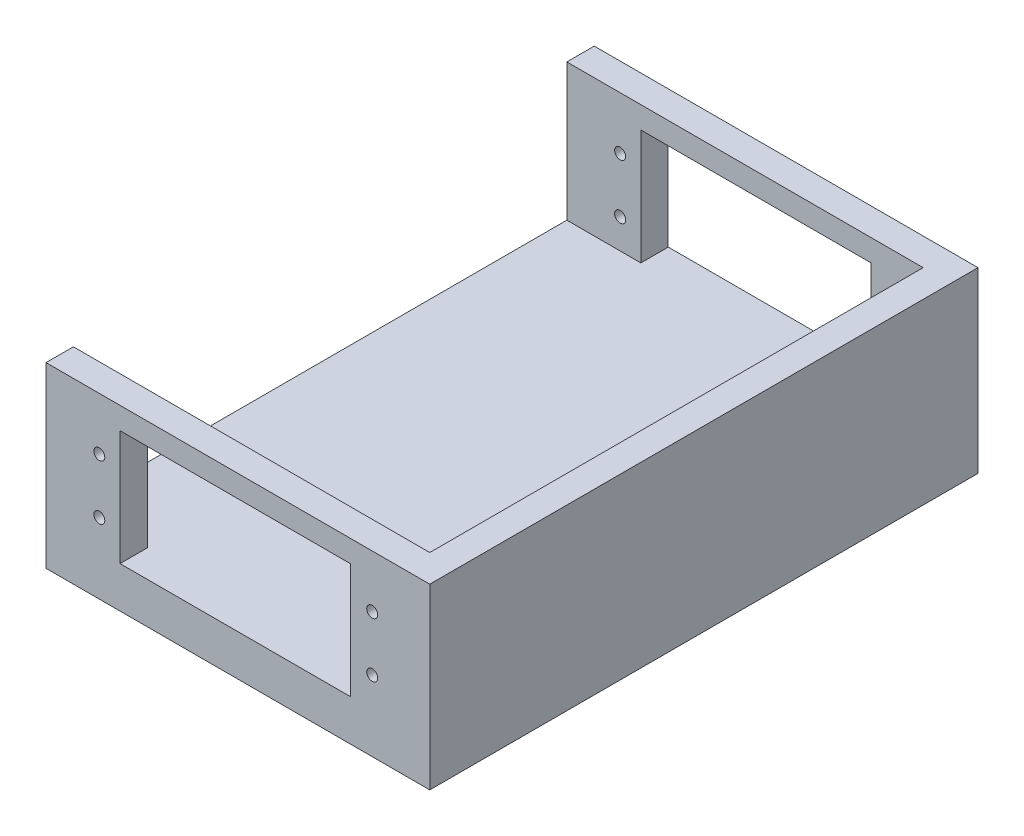
ISO-10303-21;
HEADER;
FILE_DESCRIPTION(('STEP AP214'),'2;1');
FILE_NAME('part.step','',(''),(''),'','','');
FILE_SCHEMA(('AUTOMOTIVE_DESIGN { 1 0 10303 214 1 1 1 1 }'));
ENDSEC;
DATA;
#1=APPLICATION_CONTEXT('core data for automotive mechanical design processes');
#2=APPLICATION_PROTOCOL_DEFINITION('international standard','automotive_design',2000,#1);
#3=PRODUCT_CONTEXT('',#1,'mechanical');
#4=PRODUCT('Part','Part','',(#3));
#5=PRODUCT_RELATED_PRODUCT_CATEGORY('part','',(#4));
#6=PRODUCT_DEFINITION_FORMATION('','',#4);
#7=PRODUCT_DEFINITION_CONTEXT('part definition',#1,'design');
#8=PRODUCT_DEFINITION('design','',#6,#7);
#9=PRODUCT_DEFINITION_SHAPE('','',#8);
#10=(LENGTH_UNIT() NAMED_UNIT(*) SI_UNIT(.MILLI.,.METRE.));
#11=(NAMED_UNIT(*) PLANE_ANGLE_UNIT() SI_UNIT($,.RADIAN.));
#12=(NAMED_UNIT(*) SI_UNIT($,.STERADIAN.) SOLID_ANGLE_UNIT());
#13=UNCERTAINTY_MEASURE_WITH_UNIT(LENGTH_MEASURE(1.E-05),#10,'distance_accuracy_value','');
#14=(GEOMETRIC_REPRESENTATION_CONTEXT(3) GLOBAL_UNCERTAINTY_ASSIGNED_CONTEXT((#13)) GLOBAL_UNIT_ASSIGNED_CONTEXT((#10,
#11,#12)) REPRESENTATION_CONTEXT('',''));
#15=CARTESIAN_POINT('',(0.,0.,0.));
#16=DIRECTION('',(0.,0.,1.));
#17=DIRECTION('',(1.,0.,0.));
#18=AXIS2_PLACEMENT_3D('',#15,#16,#17);
#19=CARTESIAN_POINT('',(0.,7.5,-100.));
#20=DIRECTION('',(0.,0.,-1.));
#21=DIRECTION('',(-1.,0.,0.));
#22=AXIS2_PLACEMENT_3D('',#19,#20,#21);
#23=PLANE('',#22);
#24=CARTESIAN_POINT('',(59.5,12.9,-100.));
#25=DIRECTION('',(0.,0.,1.));
#26=DIRECTION('',(1.,0.,0.));
#27=AXIS2_PLACEMENT_3D('',#24,#25,#26);
#28=CIRCLE('',#27,1.00000000000001);
#29=CARTESIAN_POINT('',(60.5,12.9,-100.));
#30=VERTEX_POINT('',#29);
#31=EDGE_CURVE('E180',#30,#30,#28,.T.);
#32=ORIENTED_EDGE('',*,*,#31,.T.);
#33=EDGE_LOOP('',(#32));
#34=FACE_BOUND('',#33,.T.);
#35=CARTESIAN_POINT('',(9.72077339804633,22.8999999999995,-100.));
#36=DIRECTION('',(0.,0.,1.));
#37=DIRECTION('',(1.,0.,0.));
#38=AXIS2_PLACEMENT_3D('',#35,#36,#37);
#39=CIRCLE('',#38,0.999999999999998);
#40=CARTESIAN_POINT('',(10.7207733980463,22.8999999999995,-100.));
#41=VERTEX_POINT('',#40);
#42=EDGE_CURVE('E183',#41,#41,#39,.T.);
#43=ORIENTED_EDGE('',*,*,#42,.T.);
#44=EDGE_LOOP('',(#43));
#45=FACE_BOUND('',#44,.T.);
#46=DIRECTION('',(1.,0.,0.));
#47=VECTOR('',#46,1.);
#48=CARTESIAN_POINT('',(0.,0.,-100.));
#49=LINE('',#48,#47);
#50=CARTESIAN_POINT('',(0.,0.,-100.));
#51=VERTEX_POINT('',#50);
#52=CARTESIAN_POINT('',(70.,0.,-100.));
#53=VERTEX_POINT('',#52);
#54=EDGE_CURVE('E217',#51,#53,#49,.T.);
#55=ORIENTED_EDGE('',*,*,#54,.F.);
#56=DIRECTION('',(0.,-1.,0.));
#57=VECTOR('',#56,1.);
#58=CARTESIAN_POINT('',(0.,7.5,-100.));
#59=LINE('',#58,#57);
#60=CARTESIAN_POINT('',(0.,32.5,-100.));
#61=VERTEX_POINT('',#60);
#62=EDGE_CURVE('E220',#61,#51,#59,.T.);
#63=ORIENTED_EDGE('',*,*,#62,.F.);
#64=DIRECTION('',(1.,0.,0.));
#65=VECTOR('',#64,1.);
#66=CARTESIAN_POINT('',(0.,32.5,-100.));
#67=LINE('',#66,#65);
#68=CARTESIAN_POINT('',(70.,32.5,-100.));
#69=VERTEX_POINT('',#68);
#70=EDGE_CURVE('E171',#61,#69,#67,.T.);
#71=ORIENTED_EDGE('',*,*,#70,.T.);
#72=DIRECTION('',(0.,-1.,0.));
#73=VECTOR('',#72,1.);
#74=CARTESIAN_POINT('',(70.,7.5,-100.));
#75=LINE('',#74,#73);
#76=EDGE_CURVE('E223',#69,#53,#75,.T.);
#77=ORIENTED_EDGE('',*,*,#76,.T.);
#78=EDGE_LOOP('',(#55,#63,#71,#77));
#79=FACE_BOUND('',#78,.T.);
#80=DIRECTION('',(-1.,0.,0.));
#81=VECTOR('',#80,1.);
#82=CARTESIAN_POINT('',(13.5,28.5,-100.));
#83=LINE('',#82,#81);
#84=CARTESIAN_POINT('',(55.5,28.5,-100.));
#85=VERTEX_POINT('',#84);
#86=CARTESIAN_POINT('',(13.5,28.5,-100.));
#87=VERTEX_POINT('',#86);
#88=EDGE_CURVE('E192',#85,#87,#83,.T.);
#89=ORIENTED_EDGE('',*,*,#88,.T.);
#90=DIRECTION('',(0.,-1.,0.));
#91=VECTOR('',#90,1.);
#92=CARTESIAN_POINT('',(13.5,28.5,-100.));
#93=LINE('',#92,#91);
#94=CARTESIAN_POINT('',(13.5,7.5,-100.));
#95=VERTEX_POINT('',#94);
#96=EDGE_CURVE('E60',#87,#95,#93,.T.);
#97=ORIENTED_EDGE('',*,*,#96,.T.);
#98=DIRECTION('',(1.,0.,0.));
#99=VECTOR('',#98,1.);
#100=CARTESIAN_POINT('',(13.5,7.5,-100.));
#101=LINE('',#100,#99);
#102=CARTESIAN_POINT('',(55.5,7.5,-100.));
#103=VERTEX_POINT('',#102);
#104=EDGE_CURVE('E198',#95,#103,#101,.T.);
#105=ORIENTED_EDGE('',*,*,#104,.T.);
#106=DIRECTION('',(0.,1.,0.));
#107=VECTOR('',#106,1.);
#108=CARTESIAN_POINT('',(55.5,28.5,-100.));
#109=LINE('',#108,#107);
#110=EDGE_CURVE('E195',#103,#85,#109,.T.);
#111=ORIENTED_EDGE('',*,*,#110,.T.);
#112=EDGE_LOOP('',(#89,#97,#105,#111));
#113=FACE_BOUND('',#112,.T.);
#114=CARTESIAN_POINT('',(9.72077339804633,12.8999999999995,-100.));
#115=DIRECTION('',(0.,0.,1.));
#116=DIRECTION('',(1.,0.,0.));
#117=AXIS2_PLACEMENT_3D('',#114,#115,#116);
#118=CIRCLE('',#117,0.999999999999998);
#119=CARTESIAN_POINT('',(10.7207733980463,12.8999999999995,-100.));
#120=VERTEX_POINT('',#119);
#121=EDGE_CURVE('E186',#120,#120,#118,.T.);
#122=ORIENTED_EDGE('',*,*,#121,.T.);
#123=EDGE_LOOP('',(#122));
#124=FACE_BOUND('',#123,.T.);
#125=CARTESIAN_POINT('',(59.5,22.9,-100.));
#126=DIRECTION('',(0.,0.,1.));
#127=DIRECTION('',(1.,0.,0.));
#128=AXIS2_PLACEMENT_3D('',#125,#126,#127);
#129=CIRCLE('',#128,0.999999999999998);
#130=CARTESIAN_POINT('',(60.5,22.9,-100.));
#131=VERTEX_POINT('',#130);
#132=EDGE_CURVE('E177',#131,#131,#129,.T.);
#133=ORIENTED_EDGE('',*,*,#132,.T.);
#134=EDGE_LOOP('',(#133));
#135=FACE_BOUND('',#134,.T.);
#136=ADVANCED_FACE('F35',(#34,#45,#79,#113,#124,#135),#23,.T.);
#137=CARTESIAN_POINT('',(0.,32.5,-95.));
#138=DIRECTION('',(0.,0.,1.));
#139=DIRECTION('',(1.,0.,0.));
#140=AXIS2_PLACEMENT_3D('',#137,#138,#139);
#141=PLANE('',#140);
#142=DIRECTION('',(0.,1.,0.));
#143=VECTOR('',#142,1.);
#144=CARTESIAN_POINT('',(65.,7.5,-95.));
#145=LINE('',#144,#143);
#146=CARTESIAN_POINT('',(65.,7.5,-95.));
#147=VERTEX_POINT('',#146);
#148=CARTESIAN_POINT('',(65.,32.5,-95.));
#149=VERTEX_POINT('',#148);
#150=EDGE_CURVE('E155',#147,#149,#145,.T.);
#151=ORIENTED_EDGE('',*,*,#150,.T.);
#152=DIRECTION('',(-1.,0.,0.));
#153=VECTOR('',#152,1.);
#154=CARTESIAN_POINT('',(0.,32.5,-95.));
#155=LINE('',#154,#153);
#156=CARTESIAN_POINT('',(0.,32.5,-95.));
#157=VERTEX_POINT('',#156);
#158=EDGE_CURVE('E162',#149,#157,#155,.T.);
#159=ORIENTED_EDGE('',*,*,#158,.T.);
#160=DIRECTION('',(0.,-1.,0.));
#161=VECTOR('',#160,1.);
#162=CARTESIAN_POINT('',(0.,32.5,-95.));
#163=LINE('',#162,#161);
#164=CARTESIAN_POINT('',(0.,7.5,-95.));
#165=VERTEX_POINT('',#164);
#166=EDGE_CURVE('E213',#157,#165,#163,.T.);
#167=ORIENTED_EDGE('',*,*,#166,.T.);
#168=DIRECTION('',(-1.,0.,0.));
#169=VECTOR('',#168,1.);
#170=CARTESIAN_POINT('',(0.,7.5,-95.));
#171=LINE('',#170,#169);
#172=CARTESIAN_POINT('',(13.5,7.5,-95.));
#173=VERTEX_POINT('',#172);
#174=EDGE_CURVE('E215',#173,#165,#171,.T.);
#175=ORIENTED_EDGE('',*,*,#174,.F.);
#176=DIRECTION('',(0.,1.,0.));
#177=VECTOR('',#176,1.);
#178=CARTESIAN_POINT('',(13.5,32.5,-95.));
#179=LINE('',#178,#177);
#180=CARTESIAN_POINT('',(13.5,28.5,-95.));
#181=VERTEX_POINT('',#180);
#182=EDGE_CURVE('E11',#173,#181,#179,.T.);
#183=ORIENTED_EDGE('',*,*,#182,.T.);
#184=DIRECTION('',(1.,0.,0.));
#185=VECTOR('',#184,1.);
#186=CARTESIAN_POINT('',(0.,28.5,-95.));
#187=LINE('',#186,#185);
#188=CARTESIAN_POINT('',(55.5,28.5,-95.));
#189=VERTEX_POINT('',#188);
#190=EDGE_CURVE('E300',#181,#189,#187,.T.);
#191=ORIENTED_EDGE('',*,*,#190,.T.);
#192=DIRECTION('',(0.,-1.,0.));
#193=VECTOR('',#192,1.);
#194=CARTESIAN_POINT('',(55.5,32.5,-95.));
#195=LINE('',#194,#193);
#196=CARTESIAN_POINT('',(55.5,7.5,-95.));
#197=VERTEX_POINT('',#196);
#198=EDGE_CURVE('E44',#189,#197,#195,.T.);
#199=ORIENTED_EDGE('',*,*,#198,.T.);
#200=EDGE_CURVE('E176',#147,#197,#171,.T.);
#201=ORIENTED_EDGE('',*,*,#200,.F.);
#202=EDGE_LOOP('',(#151,#159,#167,#175,#183,#191,#199,#201));
#203=FACE_BOUND('',#202,.T.);
#204=CARTESIAN_POINT('',(59.5,12.9,-95.));
#205=DIRECTION('',(0.,0.,1.));
#206=DIRECTION('',(1.,0.,0.));
#207=AXIS2_PLACEMENT_3D('',#204,#205,#206);
#208=CIRCLE('',#207,1.00000000000001);
#209=CARTESIAN_POINT('',(60.5,12.9,-95.));
#210=VERTEX_POINT('',#209);
#211=EDGE_CURVE('E319',#210,#210,#208,.F.);
#212=ORIENTED_EDGE('',*,*,#211,.T.);
#213=EDGE_LOOP('',(#212));
#214=FACE_BOUND('',#213,.T.);
#215=CARTESIAN_POINT('',(9.72077339804633,22.8999999999995,-95.));
#216=DIRECTION('',(0.,0.,1.));
#217=DIRECTION('',(1.,0.,0.));
#218=AXIS2_PLACEMENT_3D('',#215,#216,#217);
#219=CIRCLE('',#218,0.999999999999998);
#220=CARTESIAN_POINT('',(10.7207733980463,22.8999999999995,-95.));
#221=VERTEX_POINT('',#220);
#222=EDGE_CURVE('E204',#221,#221,#219,.F.);
#223=ORIENTED_EDGE('',*,*,#222,.T.);
#224=EDGE_LOOP('',(#223));
#225=FACE_BOUND('',#224,.T.);
#226=CARTESIAN_POINT('',(9.72077339804633,12.8999999999995,-95.));
#227=DIRECTION('',(0.,0.,1.));
#228=DIRECTION('',(1.,0.,0.));
#229=AXIS2_PLACEMENT_3D('',#226,#227,#228);
#230=CIRCLE('',#229,0.999999999999998);
#231=CARTESIAN_POINT('',(10.7207733980463,12.8999999999995,-95.));
#232=VERTEX_POINT('',#231);
#233=EDGE_CURVE('E317',#232,#232,#230,.F.);
#234=ORIENTED_EDGE('',*,*,#233,.T.);
#235=EDGE_LOOP('',(#234));
#236=FACE_BOUND('',#235,.T.);
#237=CARTESIAN_POINT('',(59.5,22.9,-95.));
#238=DIRECTION('',(0.,0.,1.));
#239=DIRECTION('',(1.,0.,0.));
#240=AXIS2_PLACEMENT_3D('',#237,#238,#239);
#241=CIRCLE('',#240,0.999999999999998);
#242=CARTESIAN_POINT('',(60.5,22.9,-95.));
#243=VERTEX_POINT('',#242);
#244=EDGE_CURVE('E39',#243,#243,#241,.F.);
#245=ORIENTED_EDGE('',*,*,#244,.T.);
#246=EDGE_LOOP('',(#245));
#247=FACE_BOUND('',#246,.T.);
#248=ADVANCED_FACE('F173',(#203,#214,#225,#236,#247),#141,.T.);
#249=CARTESIAN_POINT('',(0.,7.5,0.));
#250=DIRECTION('',(0.,-1.,0.));
#251=DIRECTION('',(0.,0.,-1.));
#252=AXIS2_PLACEMENT_3D('',#249,#250,#251);
#253=PLANE('',#252);
#254=DIRECTION('',(0.,0.,1.));
#255=VECTOR('',#254,1.);
#256=CARTESIAN_POINT('',(65.,7.5,-75.4950975679639));
#257=LINE('',#256,#255);
#258=CARTESIAN_POINT('',(65.,7.5,-5.));
#259=VERTEX_POINT('',#258);
#260=EDGE_CURVE('E52',#147,#259,#257,.T.);
#261=ORIENTED_EDGE('',*,*,#260,.F.);
#262=ORIENTED_EDGE('',*,*,#200,.T.);
#263=DIRECTION('',(0.,0.,-1.));
#264=VECTOR('',#263,1.);
#265=CARTESIAN_POINT('',(55.5,7.5,-70.));
#266=LINE('',#265,#264);
#267=EDGE_CURVE('E205',#197,#103,#266,.T.);
#268=ORIENTED_EDGE('',*,*,#267,.T.);
#269=ORIENTED_EDGE('',*,*,#104,.F.);
#270=DIRECTION('',(0.,0.,-1.));
#271=VECTOR('',#270,1.);
#272=CARTESIAN_POINT('',(13.5,7.5,-70.));
#273=LINE('',#272,#271);
#274=EDGE_CURVE('E202',#173,#95,#273,.T.);
#275=ORIENTED_EDGE('',*,*,#274,.F.);
#276=ORIENTED_EDGE('',*,*,#174,.T.);
#277=DIRECTION('',(0.,0.,1.));
#278=VECTOR('',#277,1.);
#279=CARTESIAN_POINT('',(0.,7.5,0.));
#280=LINE('',#279,#278);
#281=CARTESIAN_POINT('',(0.,7.5,-5.));
#282=VERTEX_POINT('',#281);
#283=EDGE_CURVE('E277',#165,#282,#280,.T.);
#284=ORIENTED_EDGE('',*,*,#283,.T.);
#285=DIRECTION('',(-1.,0.,0.));
#286=VECTOR('',#285,1.);
#287=CARTESIAN_POINT('',(0.,7.5,-5.));
#288=LINE('',#287,#286);
#289=CARTESIAN_POINT('',(13.5,7.5,-5.));
#290=VERTEX_POINT('',#289);
#291=EDGE_CURVE('E273',#290,#282,#288,.T.);
#292=ORIENTED_EDGE('',*,*,#291,.F.);
#293=DIRECTION('',(0.,0.,1.));
#294=VECTOR('',#293,1.);
#295=CARTESIAN_POINT('',(13.5,7.5,-30.));
#296=LINE('',#295,#294);
#297=CARTESIAN_POINT('',(13.5,7.5,0.));
#298=VERTEX_POINT('',#297);
#299=EDGE_CURVE('E251',#290,#298,#296,.T.);
#300=ORIENTED_EDGE('',*,*,#299,.T.);
#301=DIRECTION('',(1.,0.,0.));
#302=VECTOR('',#301,1.);
#303=CARTESIAN_POINT('',(13.5,7.5,0.));
#304=LINE('',#303,#302);
#305=CARTESIAN_POINT('',(55.5,7.5,0.));
#306=VERTEX_POINT('',#305);
#307=EDGE_CURVE('E242',#298,#306,#304,.T.);
#308=ORIENTED_EDGE('',*,*,#307,.T.);
#309=DIRECTION('',(0.,0.,1.));
#310=VECTOR('',#309,1.);
#311=CARTESIAN_POINT('',(55.5,7.5,-30.));
#312=LINE('',#311,#310);
#313=CARTESIAN_POINT('',(55.5,7.5,-5.));
#314=VERTEX_POINT('',#313);
#315=EDGE_CURVE('E257',#314,#306,#312,.T.);
#316=ORIENTED_EDGE('',*,*,#315,.F.);
#317=EDGE_CURVE('E264',#259,#314,#288,.T.);
#318=ORIENTED_EDGE('',*,*,#317,.F.);
#319=EDGE_LOOP('',(#261,#262,#268,#269,#275,#276,#284,#292,#300,#308,#316,#318));
#320=FACE_BOUND('',#319,.T.);
#321=ADVANCED_FACE('F327',(#320),#253,.F.);
#322=CARTESIAN_POINT('',(0.,32.5,-5.));
#323=DIRECTION('',(0.,0.,1.));
#324=DIRECTION('',(1.,0.,0.));
#325=AXIS2_PLACEMENT_3D('',#322,#323,#324);
#326=PLANE('',#325);
#327=CARTESIAN_POINT('',(9.72077339804633,22.8999999999995,-5.));
#328=DIRECTION('',(0.,0.,1.));
#329=DIRECTION('',(1.,0.,0.));
#330=AXIS2_PLACEMENT_3D('',#327,#328,#329);
#331=CIRCLE('',#330,0.999999999999998);
#332=CARTESIAN_POINT('',(10.7207733980463,22.8999999999995,-5.));
#333=VERTEX_POINT('',#332);
#334=EDGE_CURVE('E254',#333,#333,#331,.T.);
#335=ORIENTED_EDGE('',*,*,#334,.T.);
#336=EDGE_LOOP('',(#335));
#337=FACE_BOUND('',#336,.T.);
#338=CARTESIAN_POINT('',(9.72077339804633,12.8999999999995,-5.));
#339=DIRECTION('',(0.,0.,1.));
#340=DIRECTION('',(1.,0.,0.));
#341=AXIS2_PLACEMENT_3D('',#338,#339,#340);
#342=CIRCLE('',#341,0.999999999999998);
#343=CARTESIAN_POINT('',(10.7207733980463,12.8999999999995,-5.));
#344=VERTEX_POINT('',#343);
#345=EDGE_CURVE('E303',#344,#344,#342,.T.);
#346=ORIENTED_EDGE('',*,*,#345,.T.);
#347=EDGE_LOOP('',(#346));
#348=FACE_BOUND('',#347,.T.);
#349=CARTESIAN_POINT('',(59.5,12.9,-5.));
#350=DIRECTION('',(0.,0.,1.));
#351=DIRECTION('',(1.,0.,0.));
#352=AXIS2_PLACEMENT_3D('',#349,#350,#351);
#353=CIRCLE('',#352,1.00000000000001);
#354=CARTESIAN_POINT('',(60.5,12.9,-5.));
#355=VERTEX_POINT('',#354);
#356=EDGE_CURVE('E306',#355,#355,#353,.T.);
#357=ORIENTED_EDGE('',*,*,#356,.T.);
#358=EDGE_LOOP('',(#357));
#359=FACE_BOUND('',#358,.T.);
#360=CARTESIAN_POINT('',(59.5,22.9,-5.));
#361=DIRECTION('',(0.,0.,1.));
#362=DIRECTION('',(1.,0.,0.));
#363=AXIS2_PLACEMENT_3D('',#360,#361,#362);
#364=CIRCLE('',#363,0.999999999999998);
#365=CARTESIAN_POINT('',(60.5,22.9,-5.));
#366=VERTEX_POINT('',#365);
#367=EDGE_CURVE('E309',#366,#366,#364,.T.);
#368=ORIENTED_EDGE('',*,*,#367,.T.);
#369=EDGE_LOOP('',(#368));
#370=FACE_BOUND('',#369,.T.);
#371=DIRECTION('',(0.,1.,0.));
#372=VECTOR('',#371,1.);
#373=CARTESIAN_POINT('',(65.,7.5,-5.));
#374=LINE('',#373,#372);
#375=CARTESIAN_POINT('',(65.,32.5,-5.));
#376=VERTEX_POINT('',#375);
#377=EDGE_CURVE('E157',#259,#376,#374,.T.);
#378=ORIENTED_EDGE('',*,*,#377,.F.);
#379=ORIENTED_EDGE('',*,*,#317,.T.);
#380=DIRECTION('',(0.,1.,0.));
#381=VECTOR('',#380,1.);
#382=CARTESIAN_POINT('',(55.5,32.5,-5.));
#383=LINE('',#382,#381);
#384=CARTESIAN_POINT('',(55.5,28.5,-5.));
#385=VERTEX_POINT('',#384);
#386=EDGE_CURVE('E291',#314,#385,#383,.T.);
#387=ORIENTED_EDGE('',*,*,#386,.T.);
#388=DIRECTION('',(-1.,0.,0.));
#389=VECTOR('',#388,1.);
#390=CARTESIAN_POINT('',(0.,28.5,-5.));
#391=LINE('',#390,#389);
#392=CARTESIAN_POINT('',(13.5,28.5,-5.));
#393=VERTEX_POINT('',#392);
#394=EDGE_CURVE('E294',#385,#393,#391,.T.);
#395=ORIENTED_EDGE('',*,*,#394,.T.);
#396=DIRECTION('',(0.,-1.,0.));
#397=VECTOR('',#396,1.);
#398=CARTESIAN_POINT('',(13.5,32.5,-5.));
#399=LINE('',#398,#397);
#400=EDGE_CURVE('E297',#393,#290,#399,.T.);
#401=ORIENTED_EDGE('',*,*,#400,.T.);
#402=ORIENTED_EDGE('',*,*,#291,.T.);
#403=DIRECTION('',(0.,-1.,0.));
#404=VECTOR('',#403,1.);
#405=CARTESIAN_POINT('',(0.,32.5,-5.));
#406=LINE('',#405,#404);
#407=CARTESIAN_POINT('',(0.,32.5,-5.));
#408=VERTEX_POINT('',#407);
#409=EDGE_CURVE('E271',#408,#282,#406,.T.);
#410=ORIENTED_EDGE('',*,*,#409,.F.);
#411=DIRECTION('',(-1.,0.,0.));
#412=VECTOR('',#411,1.);
#413=CARTESIAN_POINT('',(0.,32.5,-5.));
#414=LINE('',#413,#412);
#415=EDGE_CURVE('E269',#376,#408,#414,.T.);
#416=ORIENTED_EDGE('',*,*,#415,.F.);
#417=EDGE_LOOP('',(#378,#379,#387,#395,#401,#402,#410,#416));
#418=FACE_BOUND('',#417,.T.);
#419=ADVANCED_FACE('F336',(#337,#348,#359,#370,#418),#326,.F.);
#420=CARTESIAN_POINT('',(0.,7.5,0.));
#421=DIRECTION('',(1.,0.,0.));
#422=DIRECTION('',(0.,0.,-1.));
#423=AXIS2_PLACEMENT_3D('',#420,#421,#422);
#424=PLANE('',#423);
#425=DIRECTION('',(0.,0.,1.));
#426=VECTOR('',#425,1.);
#427=CARTESIAN_POINT('',(0.,0.,0.));
#428=LINE('',#427,#426);
#429=CARTESIAN_POINT('',(0.,0.,0.));
#430=VERTEX_POINT('',#429);
#431=EDGE_CURVE('E276',#51,#430,#428,.T.);
#432=ORIENTED_EDGE('',*,*,#431,.T.);
#433=DIRECTION('',(0.,-1.,0.));
#434=VECTOR('',#433,1.);
#435=CARTESIAN_POINT('',(0.,7.5,0.));
#436=LINE('',#435,#434);
#437=CARTESIAN_POINT('',(0.,32.5,0.));
#438=VERTEX_POINT('',#437);
#439=EDGE_CURVE('E288',#438,#430,#436,.T.);
#440=ORIENTED_EDGE('',*,*,#439,.F.);
#441=DIRECTION('',(0.,0.,1.));
#442=VECTOR('',#441,1.);
#443=CARTESIAN_POINT('',(0.,32.5,0.));
#444=LINE('',#443,#442);
#445=EDGE_CURVE('E261',#408,#438,#444,.T.);
#446=ORIENTED_EDGE('',*,*,#445,.F.);
#447=ORIENTED_EDGE('',*,*,#409,.T.);
#448=ORIENTED_EDGE('',*,*,#283,.F.);
#449=ORIENTED_EDGE('',*,*,#166,.F.);
#450=DIRECTION('',(0.,0.,-1.));
#451=VECTOR('',#450,1.);
#452=CARTESIAN_POINT('',(0.,32.5,-100.));
#453=LINE('',#452,#451);
#454=EDGE_CURVE('E167',#157,#61,#453,.T.);
#455=ORIENTED_EDGE('',*,*,#454,.T.);
#456=ORIENTED_EDGE('',*,*,#62,.T.);
#457=EDGE_LOOP('',(#432,#440,#446,#447,#448,#449,#455,#456));
#458=FACE_BOUND('',#457,.T.);
#459=ADVANCED_FACE('F37',(#458),#424,.F.);
#460=CARTESIAN_POINT('',(0.,7.5,0.));
#461=DIRECTION('',(0.,0.,-1.));
#462=DIRECTION('',(-1.,0.,0.));
#463=AXIS2_PLACEMENT_3D('',#460,#461,#462);
#464=PLANE('',#463);
#465=CARTESIAN_POINT('',(59.5,22.9,0.));
#466=DIRECTION('',(0.,0.,1.));
#467=DIRECTION('',(1.,0.,0.));
#468=AXIS2_PLACEMENT_3D('',#465,#466,#467);
#469=CIRCLE('',#468,0.999999999999998);
#470=CARTESIAN_POINT('',(60.5,22.9,0.));
#471=VERTEX_POINT('',#470);
#472=EDGE_CURVE('E228',#471,#471,#469,.T.);
#473=ORIENTED_EDGE('',*,*,#472,.F.);
#474=EDGE_LOOP('',(#473));
#475=FACE_BOUND('',#474,.T.);
#476=CARTESIAN_POINT('',(59.5,12.9,0.));
#477=DIRECTION('',(0.,0.,1.));
#478=DIRECTION('',(1.,0.,0.));
#479=AXIS2_PLACEMENT_3D('',#476,#477,#478);
#480=CIRCLE('',#479,1.00000000000001);
#481=CARTESIAN_POINT('',(60.5,12.9,0.));
#482=VERTEX_POINT('',#481);
#483=EDGE_CURVE('E236',#482,#482,#480,.T.);
#484=ORIENTED_EDGE('',*,*,#483,.F.);
#485=EDGE_LOOP('',(#484));
#486=FACE_BOUND('',#485,.T.);
#487=CARTESIAN_POINT('',(9.72077339804633,12.8999999999995,0.));
#488=DIRECTION('',(0.,0.,1.));
#489=DIRECTION('',(1.,0.,0.));
#490=AXIS2_PLACEMENT_3D('',#487,#488,#489);
#491=CIRCLE('',#490,0.999999999999998);
#492=CARTESIAN_POINT('',(10.7207733980463,12.8999999999995,0.));
#493=VERTEX_POINT('',#492);
#494=EDGE_CURVE('E233',#493,#493,#491,.T.);
#495=ORIENTED_EDGE('',*,*,#494,.F.);
#496=EDGE_LOOP('',(#495));
#497=FACE_BOUND('',#496,.T.);
#498=CARTESIAN_POINT('',(9.72077339804633,22.8999999999995,0.));
#499=DIRECTION('',(0.,0.,1.));
#500=DIRECTION('',(1.,0.,0.));
#501=AXIS2_PLACEMENT_3D('',#498,#499,#500);
#502=CIRCLE('',#501,0.999999999999998);
#503=CARTESIAN_POINT('',(10.7207733980463,22.8999999999995,0.));
#504=VERTEX_POINT('',#503);
#505=EDGE_CURVE('E229',#504,#504,#502,.T.);
#506=ORIENTED_EDGE('',*,*,#505,.F.);
#507=EDGE_LOOP('',(#506));
#508=FACE_BOUND('',#507,.T.);
#509=ORIENTED_EDGE('',*,*,#307,.F.);
#510=DIRECTION('',(0.,-1.,0.));
#511=VECTOR('',#510,1.);
#512=CARTESIAN_POINT('',(13.5,28.5,0.));
#513=LINE('',#512,#511);
#514=CARTESIAN_POINT('',(13.5,28.5,0.));
#515=VERTEX_POINT('',#514);
#516=EDGE_CURVE('E232',#515,#298,#513,.T.);
#517=ORIENTED_EDGE('',*,*,#516,.F.);
#518=DIRECTION('',(-1.,0.,0.));
#519=VECTOR('',#518,1.);
#520=CARTESIAN_POINT('',(13.5,28.5,0.));
#521=LINE('',#520,#519);
#522=CARTESIAN_POINT('',(55.5,28.5,0.));
#523=VERTEX_POINT('',#522);
#524=EDGE_CURVE('E248',#523,#515,#521,.T.);
#525=ORIENTED_EDGE('',*,*,#524,.F.);
#526=DIRECTION('',(0.,1.,0.));
#527=VECTOR('',#526,1.);
#528=CARTESIAN_POINT('',(55.5,28.5,0.));
#529=LINE('',#528,#527);
#530=EDGE_CURVE('E245',#306,#523,#529,.T.);
#531=ORIENTED_EDGE('',*,*,#530,.F.);
#532=EDGE_LOOP('',(#509,#517,#525,#531));
#533=FACE_BOUND('',#532,.T.);
#534=DIRECTION('',(1.,0.,0.));
#535=VECTOR('',#534,1.);
#536=CARTESIAN_POINT('',(0.,0.,0.));
#537=LINE('',#536,#535);
#538=CARTESIAN_POINT('',(70.,0.,0.));
#539=VERTEX_POINT('',#538);
#540=EDGE_CURVE('E283',#430,#539,#537,.T.);
#541=ORIENTED_EDGE('',*,*,#540,.T.);
#542=DIRECTION('',(0.,-1.,0.));
#543=VECTOR('',#542,1.);
#544=CARTESIAN_POINT('',(70.,7.5,0.));
#545=LINE('',#544,#543);
#546=CARTESIAN_POINT('',(70.,32.5,0.));
#547=VERTEX_POINT('',#546);
#548=EDGE_CURVE('E279',#547,#539,#545,.T.);
#549=ORIENTED_EDGE('',*,*,#548,.F.);
#550=DIRECTION('',(1.,0.,0.));
#551=VECTOR('',#550,1.);
#552=CARTESIAN_POINT('',(0.,32.5,0.));
#553=LINE('',#552,#551);
#554=EDGE_CURVE('E263',#438,#547,#553,.T.);
#555=ORIENTED_EDGE('',*,*,#554,.F.);
#556=ORIENTED_EDGE('',*,*,#439,.T.);
#557=EDGE_LOOP('',(#541,#549,#555,#556));
#558=FACE_BOUND('',#557,.T.);
#559=ADVANCED_FACE('F343',(#475,#486,#497,#508,#533,#558),#464,.F.);
#560=CARTESIAN_POINT('',(70.,7.5,0.));
#561=DIRECTION('',(-1.,0.,0.));
#562=DIRECTION('',(0.,0.,1.));
#563=AXIS2_PLACEMENT_3D('',#560,#561,#562);
#564=PLANE('',#563);
#565=ORIENTED_EDGE('',*,*,#76,.F.);
#566=DIRECTION('',(0.,0.,-1.));
#567=VECTOR('',#566,1.);
#568=CARTESIAN_POINT('',(70.,32.5,0.));
#569=LINE('',#568,#567);
#570=EDGE_CURVE('E267',#547,#69,#569,.T.);
#571=ORIENTED_EDGE('',*,*,#570,.F.);
#572=ORIENTED_EDGE('',*,*,#548,.T.);
#573=DIRECTION('',(0.,0.,-1.));
#574=VECTOR('',#573,1.);
#575=CARTESIAN_POINT('',(70.,0.,0.));
#576=LINE('',#575,#574);
#577=EDGE_CURVE('E280',#539,#53,#576,.T.);
#578=ORIENTED_EDGE('',*,*,#577,.T.);
#579=EDGE_LOOP('',(#565,#571,#572,#578));
#580=FACE_BOUND('',#579,.T.);
#581=ADVANCED_FACE('F491',(#580),#564,.F.);
#582=CARTESIAN_POINT('',(0.,0.,0.));
#583=DIRECTION('',(0.,-1.,0.));
#584=DIRECTION('',(0.,0.,-1.));
#585=AXIS2_PLACEMENT_3D('',#582,#583,#584);
#586=PLANE('',#585);
#587=ORIENTED_EDGE('',*,*,#431,.F.);
#588=ORIENTED_EDGE('',*,*,#54,.T.);
#589=ORIENTED_EDGE('',*,*,#577,.F.);
#590=ORIENTED_EDGE('',*,*,#540,.F.);
#591=EDGE_LOOP('',(#587,#588,#589,#590));
#592=FACE_BOUND('',#591,.T.);
#593=ADVANCED_FACE('F361',(#592),#586,.T.);
#594=CARTESIAN_POINT('',(0.,32.5,0.));
#595=DIRECTION('',(0.,-1.,0.));
#596=DIRECTION('',(0.,0.,-1.));
#597=AXIS2_PLACEMENT_3D('',#594,#595,#596);
#598=PLANE('',#597);
#599=ORIENTED_EDGE('',*,*,#445,.T.);
#600=ORIENTED_EDGE('',*,*,#554,.T.);
#601=ORIENTED_EDGE('',*,*,#570,.T.);
#602=ORIENTED_EDGE('',*,*,#70,.F.);
#603=ORIENTED_EDGE('',*,*,#454,.F.);
#604=ORIENTED_EDGE('',*,*,#158,.F.);
#605=DIRECTION('',(0.,0.,1.));
#606=VECTOR('',#605,1.);
#607=CARTESIAN_POINT('',(65.,32.5,-75.4950975679639));
#608=LINE('',#607,#606);
#609=EDGE_CURVE('E151',#149,#376,#608,.T.);
#610=ORIENTED_EDGE('',*,*,#609,.T.);
#611=ORIENTED_EDGE('',*,*,#415,.T.);
#612=EDGE_LOOP('',(#599,#600,#601,#602,#603,#604,#610,#611));
#613=FACE_BOUND('',#612,.T.);
#614=ADVANCED_FACE('F164',(#613),#598,.F.);
#615=CARTESIAN_POINT('',(13.5,28.5,-30.));
#616=DIRECTION('',(-1.,0.,0.));
#617=DIRECTION('',(0.,-1.,0.));
#618=AXIS2_PLACEMENT_3D('',#615,#616,#617);
#619=PLANE('',#618);
#620=DIRECTION('',(0.,0.,1.));
#621=VECTOR('',#620,1.);
#622=CARTESIAN_POINT('',(13.5,28.5,-30.));
#623=LINE('',#622,#621);
#624=EDGE_CURVE('E252',#393,#515,#623,.T.);
#625=ORIENTED_EDGE('',*,*,#624,.T.);
#626=ORIENTED_EDGE('',*,*,#516,.T.);
#627=ORIENTED_EDGE('',*,*,#299,.F.);
#628=ORIENTED_EDGE('',*,*,#400,.F.);
#629=EDGE_LOOP('',(#625,#626,#627,#628));
#630=FACE_BOUND('',#629,.T.);
#631=ADVANCED_FACE('F353',(#630),#619,.F.);
#632=CARTESIAN_POINT('',(13.5,28.5,-30.));
#633=DIRECTION('',(0.,1.,0.));
#634=DIRECTION('',(0.,0.,1.));
#635=AXIS2_PLACEMENT_3D('',#632,#633,#634);
#636=PLANE('',#635);
#637=DIRECTION('',(0.,0.,1.));
#638=VECTOR('',#637,1.);
#639=CARTESIAN_POINT('',(55.5,28.5,-30.));
#640=LINE('',#639,#638);
#641=EDGE_CURVE('E255',#385,#523,#640,.T.);
#642=ORIENTED_EDGE('',*,*,#641,.T.);
#643=ORIENTED_EDGE('',*,*,#524,.T.);
#644=ORIENTED_EDGE('',*,*,#624,.F.);
#645=ORIENTED_EDGE('',*,*,#394,.F.);
#646=EDGE_LOOP('',(#642,#643,#644,#645));
#647=FACE_BOUND('',#646,.T.);
#648=ADVANCED_FACE('F352',(#647),#636,.F.);
#649=CARTESIAN_POINT('',(55.5,28.5,-30.));
#650=DIRECTION('',(1.,0.,0.));
#651=DIRECTION('',(0.,0.,-1.));
#652=AXIS2_PLACEMENT_3D('',#649,#650,#651);
#653=PLANE('',#652);
#654=ORIENTED_EDGE('',*,*,#315,.T.);
#655=ORIENTED_EDGE('',*,*,#530,.T.);
#656=ORIENTED_EDGE('',*,*,#641,.F.);
#657=ORIENTED_EDGE('',*,*,#386,.F.);
#658=EDGE_LOOP('',(#654,#655,#656,#657));
#659=FACE_BOUND('',#658,.T.);
#660=ADVANCED_FACE('F348',(#659),#653,.F.);
#661=CARTESIAN_POINT('',(9.72077339804633,22.8999999999995,-30.));
#662=DIRECTION('',(0.,0.,1.));
#663=DIRECTION('',(1.,0.,0.));
#664=AXIS2_PLACEMENT_3D('',#661,#662,#663);
#665=CYLINDRICAL_SURFACE('',#664,0.999999999999998);
#666=ORIENTED_EDGE('',*,*,#505,.T.);
#667=EDGE_LOOP('',(#666));
#668=FACE_BOUND('',#667,.T.);
#669=ORIENTED_EDGE('',*,*,#334,.F.);
#670=EDGE_LOOP('',(#669));
#671=FACE_BOUND('',#670,.T.);
#672=ADVANCED_FACE('F378',(#668,#671),#665,.F.);
#673=CARTESIAN_POINT('',(9.72077339804633,12.8999999999995,-30.));
#674=DIRECTION('',(0.,0.,1.));
#675=DIRECTION('',(1.,0.,0.));
#676=AXIS2_PLACEMENT_3D('',#673,#674,#675);
#677=CYLINDRICAL_SURFACE('',#676,0.999999999999998);
#678=ORIENTED_EDGE('',*,*,#494,.T.);
#679=EDGE_LOOP('',(#678));
#680=FACE_BOUND('',#679,.T.);
#681=ORIENTED_EDGE('',*,*,#345,.F.);
#682=EDGE_LOOP('',(#681));
#683=FACE_BOUND('',#682,.T.);
#684=ADVANCED_FACE('F381',(#680,#683),#677,.F.);
#685=CARTESIAN_POINT('',(59.5,12.9,-30.));
#686=DIRECTION('',(0.,0.,1.));
#687=DIRECTION('',(1.,0.,0.));
#688=AXIS2_PLACEMENT_3D('',#685,#686,#687);
#689=CYLINDRICAL_SURFACE('',#688,1.00000000000001);
#690=ORIENTED_EDGE('',*,*,#483,.T.);
#691=EDGE_LOOP('',(#690));
#692=FACE_BOUND('',#691,.T.);
#693=ORIENTED_EDGE('',*,*,#356,.F.);
#694=EDGE_LOOP('',(#693));
#695=FACE_BOUND('',#694,.T.);
#696=ADVANCED_FACE('F385',(#692,#695),#689,.F.);
#697=CARTESIAN_POINT('',(59.5,22.9,-30.));
#698=DIRECTION('',(0.,0.,1.));
#699=DIRECTION('',(1.,0.,0.));
#700=AXIS2_PLACEMENT_3D('',#697,#698,#699);
#701=CYLINDRICAL_SURFACE('',#700,0.999999999999998);
#702=ORIENTED_EDGE('',*,*,#472,.T.);
#703=EDGE_LOOP('',(#702));
#704=FACE_BOUND('',#703,.T.);
#705=ORIENTED_EDGE('',*,*,#367,.F.);
#706=EDGE_LOOP('',(#705));
#707=FACE_BOUND('',#706,.T.);
#708=ADVANCED_FACE('F377',(#704,#707),#701,.F.);
#709=CARTESIAN_POINT('',(65.,7.5,-75.4950975679639));
#710=DIRECTION('',(1.,0.,0.));
#711=DIRECTION('',(0.,0.,-1.));
#712=AXIS2_PLACEMENT_3D('',#709,#710,#711);
#713=PLANE('',#712);
#714=ORIENTED_EDGE('',*,*,#609,.F.);
#715=ORIENTED_EDGE('',*,*,#150,.F.);
#716=ORIENTED_EDGE('',*,*,#260,.T.);
#717=ORIENTED_EDGE('',*,*,#377,.T.);
#718=EDGE_LOOP('',(#714,#715,#716,#717));
#719=FACE_BOUND('',#718,.T.);
#720=ADVANCED_FACE('F153',(#719),#713,.F.);
#721=CARTESIAN_POINT('',(13.5,28.5,-70.));
#722=DIRECTION('',(1.,0.,0.));
#723=DIRECTION('',(0.,1.,0.));
#724=AXIS2_PLACEMENT_3D('',#721,#722,#723);
#725=PLANE('',#724);
#726=ORIENTED_EDGE('',*,*,#274,.T.);
#727=ORIENTED_EDGE('',*,*,#96,.F.);
#728=DIRECTION('',(0.,0.,-1.));
#729=VECTOR('',#728,1.);
#730=CARTESIAN_POINT('',(13.5,28.5,-70.));
#731=LINE('',#730,#729);
#732=EDGE_CURVE('E201',#181,#87,#731,.T.);
#733=ORIENTED_EDGE('',*,*,#732,.F.);
#734=ORIENTED_EDGE('',*,*,#182,.F.);
#735=EDGE_LOOP('',(#726,#727,#733,#734));
#736=FACE_BOUND('',#735,.T.);
#737=ADVANCED_FACE('F376',(#736),#725,.T.);
#738=CARTESIAN_POINT('',(55.5,28.5,-70.));
#739=DIRECTION('',(-1.,0.,0.));
#740=DIRECTION('',(0.,0.,1.));
#741=AXIS2_PLACEMENT_3D('',#738,#739,#740);
#742=PLANE('',#741);
#743=DIRECTION('',(0.,0.,-1.));
#744=VECTOR('',#743,1.);
#745=CARTESIAN_POINT('',(55.5,28.5,-70.));
#746=LINE('',#745,#744);
#747=EDGE_CURVE('E207',#189,#85,#746,.T.);
#748=ORIENTED_EDGE('',*,*,#747,.T.);
#749=ORIENTED_EDGE('',*,*,#110,.F.);
#750=ORIENTED_EDGE('',*,*,#267,.F.);
#751=ORIENTED_EDGE('',*,*,#198,.F.);
#752=EDGE_LOOP('',(#748,#749,#750,#751));
#753=FACE_BOUND('',#752,.T.);
#754=ADVANCED_FACE('F425',(#753),#742,.T.);
#755=CARTESIAN_POINT('',(13.5,28.5,-70.));
#756=DIRECTION('',(0.,-1.,0.));
#757=DIRECTION('',(0.,0.,-1.));
#758=AXIS2_PLACEMENT_3D('',#755,#756,#757);
#759=PLANE('',#758);
#760=ORIENTED_EDGE('',*,*,#732,.T.);
#761=ORIENTED_EDGE('',*,*,#88,.F.);
#762=ORIENTED_EDGE('',*,*,#747,.F.);
#763=ORIENTED_EDGE('',*,*,#190,.F.);
#764=EDGE_LOOP('',(#760,#761,#762,#763));
#765=FACE_BOUND('',#764,.T.);
#766=ADVANCED_FACE('F431',(#765),#759,.T.);
#767=CARTESIAN_POINT('',(9.72077339804633,22.8999999999995,-70.));
#768=DIRECTION('',(0.,0.,-1.));
#769=DIRECTION('',(-1.,0.,0.));
#770=AXIS2_PLACEMENT_3D('',#767,#768,#769);
#771=CYLINDRICAL_SURFACE('',#770,0.999999999999998);
#772=ORIENTED_EDGE('',*,*,#222,.F.);
#773=EDGE_LOOP('',(#772));
#774=FACE_BOUND('',#773,.T.);
#775=ORIENTED_EDGE('',*,*,#42,.F.);
#776=EDGE_LOOP('',(#775));
#777=FACE_BOUND('',#776,.T.);
#778=ADVANCED_FACE('F439',(#774,#777),#771,.F.);
#779=CARTESIAN_POINT('',(9.72077339804633,12.8999999999995,-70.));
#780=DIRECTION('',(0.,0.,-1.));
#781=DIRECTION('',(-1.,0.,0.));
#782=AXIS2_PLACEMENT_3D('',#779,#780,#781);
#783=CYLINDRICAL_SURFACE('',#782,0.999999999999998);
#784=ORIENTED_EDGE('',*,*,#233,.F.);
#785=EDGE_LOOP('',(#784));
#786=FACE_BOUND('',#785,.T.);
#787=ORIENTED_EDGE('',*,*,#121,.F.);
#788=EDGE_LOOP('',(#787));
#789=FACE_BOUND('',#788,.T.);
#790=ADVANCED_FACE('F447',(#786,#789),#783,.F.);
#791=CARTESIAN_POINT('',(59.5,12.9,-70.));
#792=DIRECTION('',(0.,0.,-1.));
#793=DIRECTION('',(-1.,0.,0.));
#794=AXIS2_PLACEMENT_3D('',#791,#792,#793);
#795=CYLINDRICAL_SURFACE('',#794,1.00000000000001);
#796=ORIENTED_EDGE('',*,*,#211,.F.);
#797=EDGE_LOOP('',(#796));
#798=FACE_BOUND('',#797,.T.);
#799=ORIENTED_EDGE('',*,*,#31,.F.);
#800=EDGE_LOOP('',(#799));
#801=FACE_BOUND('',#800,.T.);
#802=ADVANCED_FACE('F455',(#798,#801),#795,.F.);
#803=CARTESIAN_POINT('',(59.5,22.9,-70.));
#804=DIRECTION('',(0.,0.,-1.));
#805=DIRECTION('',(-1.,0.,0.));
#806=AXIS2_PLACEMENT_3D('',#803,#804,#805);
#807=CYLINDRICAL_SURFACE('',#806,0.999999999999998);
#808=ORIENTED_EDGE('',*,*,#244,.F.);
#809=EDGE_LOOP('',(#808));
#810=FACE_BOUND('',#809,.T.);
#811=ORIENTED_EDGE('',*,*,#132,.F.);
#812=EDGE_LOOP('',(#811));
#813=FACE_BOUND('',#812,.T.);
#814=ADVANCED_FACE('F463',(#810,#813),#807,.F.);
#815=CLOSED_SHELL('',(#136,#248,#321,#419,#459,#559,#581,#593,#614,#631,#648,#660,#672,#684,
#696,#708,#720,#737,#754,#766,#778,#790,#802,#814));
#816=MANIFOLD_SOLID_BREP('B2',#815);
#817=ADVANCED_BREP_SHAPE_REPRESENTATION('',(#18,#816),#14);
#818=SHAPE_DEFINITION_REPRESENTATION(#9,#817);
ENDSEC;
END-ISO-10303-21;
